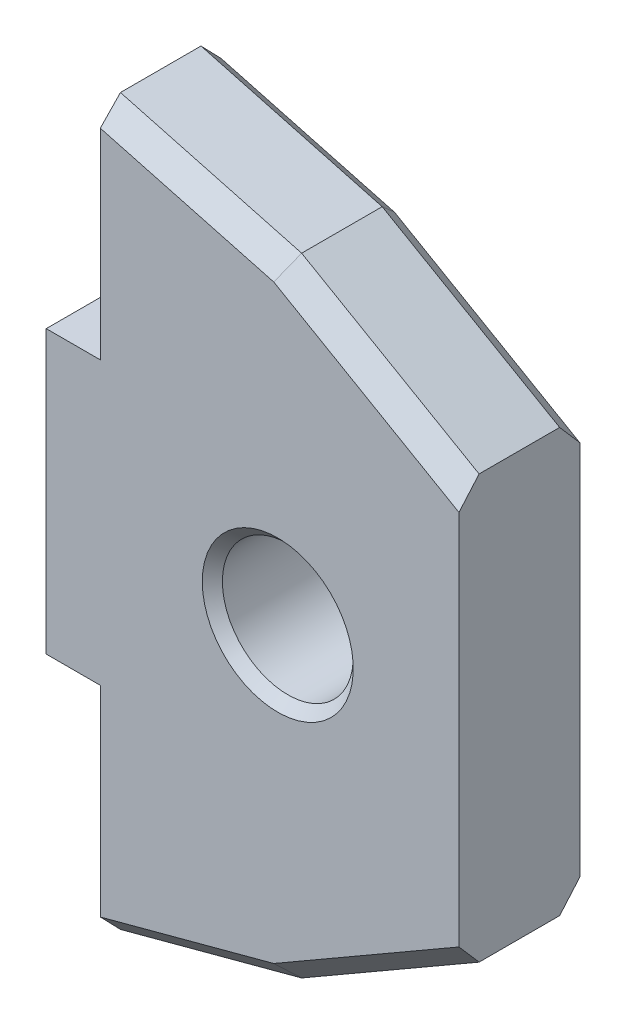
ISO-10303-21;
HEADER;
FILE_DESCRIPTION(('STEP AP214'),'2;1');
FILE_NAME('part.step','',(''),(''),'','','');
FILE_SCHEMA(('AUTOMOTIVE_DESIGN { 1 0 10303 214 1 1 1 1 }'));
ENDSEC;
DATA;
#1=APPLICATION_CONTEXT('core data for automotive mechanical design processes');
#2=APPLICATION_PROTOCOL_DEFINITION('international standard','automotive_design',2000,#1);
#3=PRODUCT_CONTEXT('',#1,'mechanical');
#4=PRODUCT('Part','Part','',(#3));
#5=PRODUCT_RELATED_PRODUCT_CATEGORY('part','',(#4));
#6=PRODUCT_DEFINITION_FORMATION('','',#4);
#7=PRODUCT_DEFINITION_CONTEXT('part definition',#1,'design');
#8=PRODUCT_DEFINITION('design','',#6,#7);
#9=PRODUCT_DEFINITION_SHAPE('','',#8);
#10=(LENGTH_UNIT() NAMED_UNIT(*) SI_UNIT(.MILLI.,.METRE.));
#11=(NAMED_UNIT(*) PLANE_ANGLE_UNIT() SI_UNIT($,.RADIAN.));
#12=(NAMED_UNIT(*) SI_UNIT($,.STERADIAN.) SOLID_ANGLE_UNIT());
#13=UNCERTAINTY_MEASURE_WITH_UNIT(LENGTH_MEASURE(1.E-05),#10,'distance_accuracy_value','');
#14=(GEOMETRIC_REPRESENTATION_CONTEXT(3) GLOBAL_UNCERTAINTY_ASSIGNED_CONTEXT((#13)) GLOBAL_UNIT_ASSIGNED_CONTEXT((#10,
#11,#12)) REPRESENTATION_CONTEXT('',''));
#15=CARTESIAN_POINT('',(0.,0.,0.));
#16=DIRECTION('',(0.,0.,1.));
#17=DIRECTION('',(1.,0.,0.));
#18=AXIS2_PLACEMENT_3D('',#15,#16,#17);
#19=CARTESIAN_POINT('',(23.3730669589466,-31.1769145362397,6.));
#20=DIRECTION('',(-0.500000000000001,0.866025403784438,0.));
#21=DIRECTION('',(-0.866025403784438,-0.500000000000001,0.));
#22=AXIS2_PLACEMENT_3D('',#19,#20,#21);
#23=PLANE('',#22);
#24=DIRECTION('',(0.,0.,-1.));
#25=VECTOR('',#24,1.);
#26=CARTESIAN_POINT('',(23.3730669589466,-31.1769145362397,6.));
#27=LINE('',#26,#25);
#28=CARTESIAN_POINT('',(23.3730669589466,-31.1769145362397,4.));
#29=VERTEX_POINT('',#28);
#30=CARTESIAN_POINT('',(23.3730669589466,-31.1769145362397,-4.00000000000001));
#31=VERTEX_POINT('',#30);
#32=EDGE_CURVE('E188',#29,#31,#27,.T.);
#33=ORIENTED_EDGE('',*,*,#32,.T.);
#34=DIRECTION('',(0.866025403784438,0.500000000000001,0.));
#35=VECTOR('',#34,1.);
#36=CARTESIAN_POINT('',(41.,-21.,-4.00000000000001));
#37=LINE('',#36,#35);
#38=CARTESIAN_POINT('',(41.,-21.,-4.00000000000001));
#39=VERTEX_POINT('',#38);
#40=EDGE_CURVE('E255',#31,#39,#37,.T.);
#41=ORIENTED_EDGE('',*,*,#40,.T.);
#42=DIRECTION('',(0.,0.,-1.));
#43=VECTOR('',#42,1.);
#44=CARTESIAN_POINT('',(41.,-21.,6.));
#45=LINE('',#44,#43);
#46=CARTESIAN_POINT('',(41.,-21.,4.));
#47=VERTEX_POINT('',#46);
#48=EDGE_CURVE('E221',#47,#39,#45,.T.);
#49=ORIENTED_EDGE('',*,*,#48,.F.);
#50=DIRECTION('',(-0.866025403784438,-0.500000000000001,0.));
#51=VECTOR('',#50,1.);
#52=CARTESIAN_POINT('',(23.3730669589466,-31.1769145362397,4.));
#53=LINE('',#52,#51);
#54=EDGE_CURVE('E253',#47,#29,#53,.T.);
#55=ORIENTED_EDGE('',*,*,#54,.T.);
#56=EDGE_LOOP('',(#33,#41,#49,#55));
#57=FACE_BOUND('',#56,.T.);
#58=ADVANCED_FACE('F41',(#57),#23,.F.);
#59=CARTESIAN_POINT('',(41.,21.,6.));
#60=DIRECTION('',(-1.,0.,0.));
#61=DIRECTION('',(0.,0.,1.));
#62=AXIS2_PLACEMENT_3D('',#59,#60,#61);
#63=PLANE('',#62);
#64=ORIENTED_EDGE('',*,*,#48,.T.);
#65=DIRECTION('',(0.,0.755928946018457,-0.654653670707974));
#66=VECTOR('',#65,1.);
#67=CARTESIAN_POINT('',(41.,-26.8153797349942,1.03626658315813));
#68=LINE('',#67,#66);
#69=CARTESIAN_POINT('',(41.,-18.6905989232415,-6.));
#70=VERTEX_POINT('',#69);
#71=EDGE_CURVE('E263',#39,#70,#68,.T.);
#72=ORIENTED_EDGE('',*,*,#71,.T.);
#73=DIRECTION('',(0.,1.,0.));
#74=VECTOR('',#73,1.);
#75=CARTESIAN_POINT('',(41.,21.,-6.));
#76=LINE('',#75,#74);
#77=CARTESIAN_POINT('',(41.,18.6905989232415,-6.));
#78=VERTEX_POINT('',#77);
#79=EDGE_CURVE('E189',#70,#78,#76,.T.);
#80=ORIENTED_EDGE('',*,*,#79,.T.);
#81=DIRECTION('',(0.,0.755928946018456,0.654653670707975));
#82=VECTOR('',#81,1.);
#83=CARTESIAN_POINT('',(41.,26.8153797349942,1.03626658315813));
#84=LINE('',#83,#82);
#85=CARTESIAN_POINT('',(41.,21.,-4.00000000000001));
#86=VERTEX_POINT('',#85);
#87=EDGE_CURVE('E259',#78,#86,#84,.T.);
#88=ORIENTED_EDGE('',*,*,#87,.T.);
#89=DIRECTION('',(0.,0.,-1.));
#90=VECTOR('',#89,1.);
#91=CARTESIAN_POINT('',(41.,21.,6.));
#92=LINE('',#91,#90);
#93=CARTESIAN_POINT('',(41.,21.,3.99999999999999));
#94=VERTEX_POINT('',#93);
#95=EDGE_CURVE('E218',#94,#86,#92,.T.);
#96=ORIENTED_EDGE('',*,*,#95,.F.);
#97=DIRECTION('',(0.,0.755928946018454,-0.654653670707978));
#98=VECTOR('',#97,1.);
#99=CARTESIAN_POINT('',(41.,26.165382378539,-0.473352360075262));
#100=LINE('',#99,#98);
#101=CARTESIAN_POINT('',(41.,18.6905989232415,6.));
#102=VERTEX_POINT('',#101);
#103=EDGE_CURVE('E257',#94,#102,#100,.F.);
#104=ORIENTED_EDGE('',*,*,#103,.T.);
#105=DIRECTION('',(0.,1.,0.));
#106=VECTOR('',#105,1.);
#107=CARTESIAN_POINT('',(41.,21.,6.));
#108=LINE('',#107,#106);
#109=CARTESIAN_POINT('',(41.,-18.6905989232415,6.));
#110=VERTEX_POINT('',#109);
#111=EDGE_CURVE('E164',#110,#102,#108,.T.);
#112=ORIENTED_EDGE('',*,*,#111,.F.);
#113=DIRECTION('',(0.,0.755928946018452,0.65465367070798));
#114=VECTOR('',#113,1.);
#115=CARTESIAN_POINT('',(41.,-26.165382378539,-0.473352360075265));
#116=LINE('',#115,#114);
#117=EDGE_CURVE('E261',#110,#47,#116,.F.);
#118=ORIENTED_EDGE('',*,*,#117,.T.);
#119=EDGE_LOOP('',(#64,#72,#80,#88,#96,#104,#112,#118));
#120=FACE_BOUND('',#119,.T.);
#121=ADVANCED_FACE('F303',(#120),#63,.F.);
#122=CARTESIAN_POINT('',(23.3730669589466,31.1769145362397,6.));
#123=DIRECTION('',(-0.500000000000001,-0.866025403784438,0.));
#124=DIRECTION('',(0.866025403784438,-0.500000000000001,0.));
#125=AXIS2_PLACEMENT_3D('',#122,#123,#124);
#126=PLANE('',#125);
#127=ORIENTED_EDGE('',*,*,#95,.T.);
#128=DIRECTION('',(-0.866025403784438,0.500000000000001,0.));
#129=VECTOR('',#128,1.);
#130=CARTESIAN_POINT('',(23.3730669589466,31.1769145362397,-4.00000000000001));
#131=LINE('',#130,#129);
#132=CARTESIAN_POINT('',(23.3730669589466,31.1769145362397,-4.00000000000001));
#133=VERTEX_POINT('',#132);
#134=EDGE_CURVE('E275',#86,#133,#131,.T.);
#135=ORIENTED_EDGE('',*,*,#134,.T.);
#136=DIRECTION('',(0.,0.,-1.));
#137=VECTOR('',#136,1.);
#138=CARTESIAN_POINT('',(23.3730669589466,31.1769145362397,6.));
#139=LINE('',#138,#137);
#140=CARTESIAN_POINT('',(23.3730669589466,31.1769145362397,3.99999999999999));
#141=VERTEX_POINT('',#140);
#142=EDGE_CURVE('E216',#141,#133,#139,.T.);
#143=ORIENTED_EDGE('',*,*,#142,.F.);
#144=DIRECTION('',(0.866025403784438,-0.500000000000001,0.));
#145=VECTOR('',#144,1.);
#146=CARTESIAN_POINT('',(23.3730669589466,31.1769145362397,3.99999999999999));
#147=LINE('',#146,#145);
#148=EDGE_CURVE('E273',#141,#94,#147,.T.);
#149=ORIENTED_EDGE('',*,*,#148,.T.);
#150=EDGE_LOOP('',(#127,#135,#143,#149));
#151=FACE_BOUND('',#150,.T.);
#152=ADVANCED_FACE('F301',(#151),#126,.F.);
#153=CARTESIAN_POINT('',(5.37306695894657,36.,6.));
#154=DIRECTION('',(-0.258819045102523,-0.965925826289068,0.));
#155=DIRECTION('',(0.965925826289068,-0.258819045102523,0.));
#156=AXIS2_PLACEMENT_3D('',#153,#154,#155);
#157=PLANE('',#156);
#158=ORIENTED_EDGE('',*,*,#142,.T.);
#159=DIRECTION('',(-0.965925826289068,0.258819045102523,0.));
#160=VECTOR('',#159,1.);
#161=CARTESIAN_POINT('',(5.37306695894657,36.,-4.00000000000001));
#162=LINE('',#161,#160);
#163=CARTESIAN_POINT('',(5.37306695894657,36.,-4.00000000000001));
#164=VERTEX_POINT('',#163);
#165=EDGE_CURVE('E59',#133,#164,#162,.T.);
#166=ORIENTED_EDGE('',*,*,#165,.T.);
#167=DIRECTION('',(0.,0.,-1.));
#168=VECTOR('',#167,1.);
#169=CARTESIAN_POINT('',(5.37306695894657,36.,6.));
#170=LINE('',#169,#168);
#171=CARTESIAN_POINT('',(5.37306695894657,36.,3.99999999999999));
#172=VERTEX_POINT('',#171);
#173=EDGE_CURVE('E173',#172,#164,#170,.T.);
#174=ORIENTED_EDGE('',*,*,#173,.F.);
#175=DIRECTION('',(0.965925826289068,-0.258819045102523,0.));
#176=VECTOR('',#175,1.);
#177=CARTESIAN_POINT('',(5.37306695894657,36.,3.99999999999999));
#178=LINE('',#177,#176);
#179=EDGE_CURVE('E278',#172,#141,#178,.T.);
#180=ORIENTED_EDGE('',*,*,#179,.T.);
#181=EDGE_LOOP('',(#158,#166,#174,#180));
#182=FACE_BOUND('',#181,.T.);
#183=ADVANCED_FACE('F309',(#182),#157,.F.);
#184=CARTESIAN_POINT('',(5.37306695894657,14.,6.));
#185=DIRECTION('',(1.,0.,0.));
#186=DIRECTION('',(0.,1.,0.));
#187=AXIS2_PLACEMENT_3D('',#184,#185,#186);
#188=PLANE('',#187);
#189=ORIENTED_EDGE('',*,*,#173,.T.);
#190=DIRECTION('',(0.,-0.719254596676406,-0.694746590606864));
#191=VECTOR('',#190,1.);
#192=CARTESIAN_POINT('',(5.37306695894657,36.,-4.00000000000001));
#193=LINE('',#192,#191);
#194=CARTESIAN_POINT('',(5.37306695894657,33.9294476391798,-6.));
#195=VERTEX_POINT('',#194);
#196=EDGE_CURVE('E11',#164,#195,#193,.T.);
#197=ORIENTED_EDGE('',*,*,#196,.T.);
#198=DIRECTION('',(0.,-1.,0.));
#199=VECTOR('',#198,1.);
#200=CARTESIAN_POINT('',(5.37306695894657,14.,-6.));
#201=LINE('',#200,#199);
#202=CARTESIAN_POINT('',(5.37306695894657,14.,-6.));
#203=VERTEX_POINT('',#202);
#204=EDGE_CURVE('E170',#195,#203,#201,.T.);
#205=ORIENTED_EDGE('',*,*,#204,.T.);
#206=DIRECTION('',(0.,0.,-1.));
#207=VECTOR('',#206,1.);
#208=CARTESIAN_POINT('',(5.37306695894657,14.,6.));
#209=LINE('',#208,#207);
#210=CARTESIAN_POINT('',(5.37306695894657,14.,6.));
#211=VERTEX_POINT('',#210);
#212=EDGE_CURVE('E167',#211,#203,#209,.T.);
#213=ORIENTED_EDGE('',*,*,#212,.F.);
#214=DIRECTION('',(0.,-1.,0.));
#215=VECTOR('',#214,1.);
#216=CARTESIAN_POINT('',(5.37306695894657,14.,6.));
#217=LINE('',#216,#215);
#218=CARTESIAN_POINT('',(5.37306695894657,33.9294476391798,6.));
#219=VERTEX_POINT('',#218);
#220=EDGE_CURVE('E155',#219,#211,#217,.T.);
#221=ORIENTED_EDGE('',*,*,#220,.F.);
#222=DIRECTION('',(0.,-0.719254596676403,0.694746590606866));
#223=VECTOR('',#222,1.);
#224=CARTESIAN_POINT('',(5.37306695894657,33.4485530837579,6.46450847080387));
#225=LINE('',#224,#223);
#226=EDGE_CURVE('E51',#219,#172,#225,.F.);
#227=ORIENTED_EDGE('',*,*,#226,.T.);
#228=EDGE_LOOP('',(#189,#197,#205,#213,#221,#227));
#229=FACE_BOUND('',#228,.T.);
#230=ADVANCED_FACE('F168',(#229),#188,.F.);
#231=CARTESIAN_POINT('',(0.,14.,6.));
#232=DIRECTION('',(0.,-1.,0.));
#233=DIRECTION('',(0.,0.,-1.));
#234=AXIS2_PLACEMENT_3D('',#231,#232,#233);
#235=PLANE('',#234);
#236=DIRECTION('',(-1.,0.,0.));
#237=VECTOR('',#236,1.);
#238=CARTESIAN_POINT('',(0.,14.,-6.));
#239=LINE('',#238,#237);
#240=CARTESIAN_POINT('',(0.,14.,-6.));
#241=VERTEX_POINT('',#240);
#242=EDGE_CURVE('E194',#203,#241,#239,.T.);
#243=ORIENTED_EDGE('',*,*,#242,.T.);
#244=DIRECTION('',(0.,0.,-1.));
#245=VECTOR('',#244,1.);
#246=CARTESIAN_POINT('',(0.,14.,6.));
#247=LINE('',#246,#245);
#248=CARTESIAN_POINT('',(0.,14.,6.));
#249=VERTEX_POINT('',#248);
#250=EDGE_CURVE('E174',#249,#241,#247,.T.);
#251=ORIENTED_EDGE('',*,*,#250,.F.);
#252=DIRECTION('',(-1.,0.,0.));
#253=VECTOR('',#252,1.);
#254=CARTESIAN_POINT('',(0.,14.,6.));
#255=LINE('',#254,#253);
#256=EDGE_CURVE('E160',#211,#249,#255,.T.);
#257=ORIENTED_EDGE('',*,*,#256,.F.);
#258=ORIENTED_EDGE('',*,*,#212,.T.);
#259=EDGE_LOOP('',(#243,#251,#257,#258));
#260=FACE_BOUND('',#259,.T.);
#261=ADVANCED_FACE('F176',(#260),#235,.F.);
#262=CARTESIAN_POINT('',(0.,-14.,6.));
#263=DIRECTION('',(1.,0.,0.));
#264=DIRECTION('',(0.,0.,-1.));
#265=AXIS2_PLACEMENT_3D('',#262,#263,#264);
#266=PLANE('',#265);
#267=DIRECTION('',(0.,-1.,0.));
#268=VECTOR('',#267,1.);
#269=CARTESIAN_POINT('',(0.,-14.,-6.));
#270=LINE('',#269,#268);
#271=CARTESIAN_POINT('',(0.,-14.,-6.));
#272=VERTEX_POINT('',#271);
#273=EDGE_CURVE('E196',#241,#272,#270,.T.);
#274=ORIENTED_EDGE('',*,*,#273,.T.);
#275=DIRECTION('',(0.,0.,-1.));
#276=VECTOR('',#275,1.);
#277=CARTESIAN_POINT('',(0.,-14.,6.));
#278=LINE('',#277,#276);
#279=CARTESIAN_POINT('',(0.,-14.,6.));
#280=VERTEX_POINT('',#279);
#281=EDGE_CURVE('E211',#280,#272,#278,.T.);
#282=ORIENTED_EDGE('',*,*,#281,.F.);
#283=DIRECTION('',(0.,-1.,0.));
#284=VECTOR('',#283,1.);
#285=CARTESIAN_POINT('',(0.,-14.,6.));
#286=LINE('',#285,#284);
#287=EDGE_CURVE('E179',#249,#280,#286,.T.);
#288=ORIENTED_EDGE('',*,*,#287,.F.);
#289=ORIENTED_EDGE('',*,*,#250,.T.);
#290=EDGE_LOOP('',(#274,#282,#288,#289));
#291=FACE_BOUND('',#290,.T.);
#292=ADVANCED_FACE('F319',(#291),#266,.F.);
#293=CARTESIAN_POINT('',(0.,-14.,6.));
#294=DIRECTION('',(0.,1.,0.));
#295=DIRECTION('',(0.,0.,1.));
#296=AXIS2_PLACEMENT_3D('',#293,#294,#295);
#297=PLANE('',#296);
#298=DIRECTION('',(1.,0.,0.));
#299=VECTOR('',#298,1.);
#300=CARTESIAN_POINT('',(0.,-14.,-6.));
#301=LINE('',#300,#299);
#302=CARTESIAN_POINT('',(5.37306695894657,-14.,-6.));
#303=VERTEX_POINT('',#302);
#304=EDGE_CURVE('E198',#272,#303,#301,.T.);
#305=ORIENTED_EDGE('',*,*,#304,.T.);
#306=DIRECTION('',(0.,0.,-1.));
#307=VECTOR('',#306,1.);
#308=CARTESIAN_POINT('',(5.37306695894657,-14.,6.));
#309=LINE('',#308,#307);
#310=CARTESIAN_POINT('',(5.37306695894657,-14.,6.));
#311=VERTEX_POINT('',#310);
#312=EDGE_CURVE('E208',#311,#303,#309,.T.);
#313=ORIENTED_EDGE('',*,*,#312,.F.);
#314=DIRECTION('',(1.,0.,0.));
#315=VECTOR('',#314,1.);
#316=CARTESIAN_POINT('',(0.,-14.,6.));
#317=LINE('',#316,#315);
#318=EDGE_CURVE('E181',#280,#311,#317,.T.);
#319=ORIENTED_EDGE('',*,*,#318,.F.);
#320=ORIENTED_EDGE('',*,*,#281,.T.);
#321=EDGE_LOOP('',(#305,#313,#319,#320));
#322=FACE_BOUND('',#321,.T.);
#323=ADVANCED_FACE('F326',(#322),#297,.F.);
#324=CARTESIAN_POINT('',(5.37306695894657,-14.,6.));
#325=DIRECTION('',(1.,0.,0.));
#326=DIRECTION('',(0.,1.,0.));
#327=AXIS2_PLACEMENT_3D('',#324,#325,#326);
#328=PLANE('',#327);
#329=DIRECTION('',(0.,-1.,0.));
#330=VECTOR('',#329,1.);
#331=CARTESIAN_POINT('',(5.37306695894657,-14.,-6.));
#332=LINE('',#331,#330);
#333=CARTESIAN_POINT('',(5.37306695894657,-33.9294476391798,-6.));
#334=VERTEX_POINT('',#333);
#335=EDGE_CURVE('E200',#303,#334,#332,.T.);
#336=ORIENTED_EDGE('',*,*,#335,.T.);
#337=DIRECTION('',(0.,-0.719254596676405,0.694746590606864));
#338=VECTOR('',#337,1.);
#339=CARTESIAN_POINT('',(5.37306695894657,-36.,-4.00000000000001));
#340=LINE('',#339,#338);
#341=CARTESIAN_POINT('',(5.37306695894657,-36.,-4.00000000000001));
#342=VERTEX_POINT('',#341);
#343=EDGE_CURVE('E251',#334,#342,#340,.T.);
#344=ORIENTED_EDGE('',*,*,#343,.T.);
#345=DIRECTION('',(0.,0.,-1.));
#346=VECTOR('',#345,1.);
#347=CARTESIAN_POINT('',(5.37306695894657,-36.,6.));
#348=LINE('',#347,#346);
#349=CARTESIAN_POINT('',(5.37306695894657,-36.,4.));
#350=VERTEX_POINT('',#349);
#351=EDGE_CURVE('E205',#350,#342,#348,.T.);
#352=ORIENTED_EDGE('',*,*,#351,.F.);
#353=DIRECTION('',(0.,-0.719254596676402,-0.694746590606867));
#354=VECTOR('',#353,1.);
#355=CARTESIAN_POINT('',(5.37306695894657,-33.4485530837579,6.46450847080387));
#356=LINE('',#355,#354);
#357=CARTESIAN_POINT('',(5.37306695894657,-33.9294476391798,6.));
#358=VERTEX_POINT('',#357);
#359=EDGE_CURVE('E249',#350,#358,#356,.F.);
#360=ORIENTED_EDGE('',*,*,#359,.T.);
#361=DIRECTION('',(0.,-1.,0.));
#362=VECTOR('',#361,1.);
#363=CARTESIAN_POINT('',(5.37306695894657,-14.,6.));
#364=LINE('',#363,#362);
#365=EDGE_CURVE('E186',#311,#358,#364,.T.);
#366=ORIENTED_EDGE('',*,*,#365,.F.);
#367=ORIENTED_EDGE('',*,*,#312,.T.);
#368=EDGE_LOOP('',(#336,#344,#352,#360,#366,#367));
#369=FACE_BOUND('',#368,.T.);
#370=ADVANCED_FACE('F329',(#369),#328,.F.);
#371=CARTESIAN_POINT('',(5.37306695894657,-36.,6.));
#372=DIRECTION('',(-0.258819045102523,0.965925826289068,0.));
#373=DIRECTION('',(-0.965925826289068,-0.258819045102523,0.));
#374=AXIS2_PLACEMENT_3D('',#371,#372,#373);
#375=PLANE('',#374);
#376=ORIENTED_EDGE('',*,*,#351,.T.);
#377=DIRECTION('',(0.965925826289068,0.258819045102523,0.));
#378=VECTOR('',#377,1.);
#379=CARTESIAN_POINT('',(23.3730669589466,-31.1769145362397,-4.00000000000001));
#380=LINE('',#379,#378);
#381=EDGE_CURVE('E238',#342,#31,#380,.T.);
#382=ORIENTED_EDGE('',*,*,#381,.T.);
#383=ORIENTED_EDGE('',*,*,#32,.F.);
#384=DIRECTION('',(-0.965925826289068,-0.258819045102523,0.));
#385=VECTOR('',#384,1.);
#386=CARTESIAN_POINT('',(5.37306695894657,-36.,4.));
#387=LINE('',#386,#385);
#388=EDGE_CURVE('E236',#29,#350,#387,.T.);
#389=ORIENTED_EDGE('',*,*,#388,.T.);
#390=EDGE_LOOP('',(#376,#382,#383,#389));
#391=FACE_BOUND('',#390,.T.);
#392=ADVANCED_FACE('F345',(#391),#375,.F.);
#393=CARTESIAN_POINT('',(0.,0.,6.));
#394=DIRECTION('',(0.,0.,-1.));
#395=DIRECTION('',(-1.,0.,0.));
#396=AXIS2_PLACEMENT_3D('',#393,#394,#395);
#397=PLANE('',#396);
#398=CARTESIAN_POINT('',(23.,0.,6.));
#399=DIRECTION('',(0.,0.,-1.));
#400=DIRECTION('',(-1.,0.,0.));
#401=AXIS2_PLACEMENT_3D('',#398,#399,#400);
#402=CIRCLE('',#401,7.5);
#403=CARTESIAN_POINT('',(15.5,0.,6.));
#404=VERTEX_POINT('',#403);
#405=EDGE_CURVE('E230',#404,#404,#402,.T.);
#406=ORIENTED_EDGE('',*,*,#405,.T.);
#407=EDGE_LOOP('',(#406));
#408=FACE_BOUND('',#407,.T.);
#409=ORIENTED_EDGE('',*,*,#365,.T.);
#410=DIRECTION('',(0.965925826289068,0.258819045102523,0.));
#411=VECTOR('',#410,1.);
#412=CARTESIAN_POINT('',(8.84228914792704,-32.9998723552784,6.));
#413=LINE('',#412,#411);
#414=CARTESIAN_POINT('',(22.6010957737113,-29.3132112310835,6.));
#415=VERTEX_POINT('',#414);
#416=EDGE_CURVE('E270',#358,#415,#413,.T.);
#417=ORIENTED_EDGE('',*,*,#416,.T.);
#418=DIRECTION('',(0.866025403784438,0.500000000000001,0.));
#419=VECTOR('',#418,1.);
#420=CARTESIAN_POINT('',(18.3432667397367,-31.7714699700121,6.));
#421=LINE('',#420,#419);
#422=EDGE_CURVE('E268',#415,#110,#421,.T.);
#423=ORIENTED_EDGE('',*,*,#422,.T.);
#424=ORIENTED_EDGE('',*,*,#111,.T.);
#425=DIRECTION('',(-0.866025403784438,0.500000000000001,0.));
#426=VECTOR('',#425,1.);
#427=CARTESIAN_POINT('',(18.3432667397367,31.7714699700121,6.));
#428=LINE('',#427,#426);
#429=CARTESIAN_POINT('',(22.6010957737113,29.3132112310835,6.));
#430=VERTEX_POINT('',#429);
#431=EDGE_CURVE('E265',#102,#430,#428,.T.);
#432=ORIENTED_EDGE('',*,*,#431,.T.);
#433=DIRECTION('',(-0.965925826289068,0.258819045102523,0.));
#434=VECTOR('',#433,1.);
#435=CARTESIAN_POINT('',(8.84228914792704,32.9998723552784,6.));
#436=LINE('',#435,#434);
#437=EDGE_CURVE('E163',#430,#219,#436,.T.);
#438=ORIENTED_EDGE('',*,*,#437,.T.);
#439=ORIENTED_EDGE('',*,*,#220,.T.);
#440=ORIENTED_EDGE('',*,*,#256,.T.);
#441=ORIENTED_EDGE('',*,*,#287,.T.);
#442=ORIENTED_EDGE('',*,*,#318,.T.);
#443=EDGE_LOOP('',(#409,#417,#423,#424,#432,#438,#439,#440,#441,#442));
#444=FACE_BOUND('',#443,.T.);
#445=ADVANCED_FACE('F158',(#408,#444),#397,.F.);
#446=CARTESIAN_POINT('',(0.,0.,-6.));
#447=DIRECTION('',(0.,0.,-1.));
#448=DIRECTION('',(-1.,0.,0.));
#449=AXIS2_PLACEMENT_3D('',#446,#447,#448);
#450=PLANE('',#449);
#451=CARTESIAN_POINT('',(23.,0.,-6.));
#452=DIRECTION('',(0.,0.,-1.));
#453=DIRECTION('',(-1.,0.,0.));
#454=AXIS2_PLACEMENT_3D('',#451,#452,#453);
#455=CIRCLE('',#454,7.5);
#456=CARTESIAN_POINT('',(15.5,0.,-6.));
#457=VERTEX_POINT('',#456);
#458=EDGE_CURVE('E233',#457,#457,#455,.F.);
#459=ORIENTED_EDGE('',*,*,#458,.T.);
#460=EDGE_LOOP('',(#459));
#461=FACE_BOUND('',#460,.T.);
#462=DIRECTION('',(-0.866025403784438,-0.500000000000001,0.));
#463=VECTOR('',#462,1.);
#464=CARTESIAN_POINT('',(22.3730669589466,-29.4448637286709,-6.));
#465=LINE('',#464,#463);
#466=CARTESIAN_POINT('',(22.6010957737113,-29.3132112310835,-6.));
#467=VERTEX_POINT('',#466);
#468=EDGE_CURVE('E245',#70,#467,#465,.T.);
#469=ORIENTED_EDGE('',*,*,#468,.T.);
#470=DIRECTION('',(-0.965925826289068,-0.258819045102523,0.));
#471=VECTOR('',#470,1.);
#472=CARTESIAN_POINT('',(4.85542886874152,-34.0681483474219,-6.));
#473=LINE('',#472,#471);
#474=EDGE_CURVE('E247',#467,#334,#473,.T.);
#475=ORIENTED_EDGE('',*,*,#474,.T.);
#476=ORIENTED_EDGE('',*,*,#335,.F.);
#477=ORIENTED_EDGE('',*,*,#304,.F.);
#478=ORIENTED_EDGE('',*,*,#273,.F.);
#479=ORIENTED_EDGE('',*,*,#242,.F.);
#480=ORIENTED_EDGE('',*,*,#204,.F.);
#481=DIRECTION('',(0.965925826289068,-0.258819045102523,0.));
#482=VECTOR('',#481,1.);
#483=CARTESIAN_POINT('',(22.8554288687415,29.2450628836616,-6.));
#484=LINE('',#483,#482);
#485=CARTESIAN_POINT('',(22.6010957737113,29.3132112310835,-6.));
#486=VERTEX_POINT('',#485);
#487=EDGE_CURVE('E241',#195,#486,#484,.T.);
#488=ORIENTED_EDGE('',*,*,#487,.T.);
#489=DIRECTION('',(0.866025403784438,-0.500000000000001,0.));
#490=VECTOR('',#489,1.);
#491=CARTESIAN_POINT('',(40.,19.2679491924311,-6.));
#492=LINE('',#491,#490);
#493=EDGE_CURVE('E243',#486,#78,#492,.T.);
#494=ORIENTED_EDGE('',*,*,#493,.T.);
#495=ORIENTED_EDGE('',*,*,#79,.F.);
#496=EDGE_LOOP('',(#469,#475,#476,#477,#478,#479,#480,#488,#494,#495));
#497=FACE_BOUND('',#496,.T.);
#498=ADVANCED_FACE('F315',(#461,#497),#450,.T.);
#499=CARTESIAN_POINT('',(23.,0.,-6.));
#500=DIRECTION('',(0.,0.,1.));
#501=DIRECTION('',(1.,0.,0.));
#502=AXIS2_PLACEMENT_3D('',#499,#500,#501);
#503=CYLINDRICAL_SURFACE('',#502,6.5);
#504=CARTESIAN_POINT('',(23.,0.,4.99999999999999));
#505=DIRECTION('',(0.,0.,-1.));
#506=DIRECTION('',(-1.,0.,0.));
#507=AXIS2_PLACEMENT_3D('',#504,#505,#506);
#508=CIRCLE('',#507,6.5);
#509=CARTESIAN_POINT('',(16.5,0.,4.99999999999999));
#510=VERTEX_POINT('',#509);
#511=EDGE_CURVE('E227',#510,#510,#508,.F.);
#512=ORIENTED_EDGE('',*,*,#511,.T.);
#513=EDGE_LOOP('',(#512));
#514=FACE_BOUND('',#513,.T.);
#515=CARTESIAN_POINT('',(23.,0.,-5.));
#516=DIRECTION('',(0.,0.,-1.));
#517=DIRECTION('',(-1.,0.,0.));
#518=AXIS2_PLACEMENT_3D('',#515,#516,#517);
#519=CIRCLE('',#518,6.5);
#520=CARTESIAN_POINT('',(16.5,0.,-5.));
#521=VERTEX_POINT('',#520);
#522=EDGE_CURVE('E224',#521,#521,#519,.T.);
#523=ORIENTED_EDGE('',*,*,#522,.T.);
#524=EDGE_LOOP('',(#523));
#525=FACE_BOUND('',#524,.T.);
#526=ADVANCED_FACE('F384',(#514,#525),#503,.F.);
#527=CARTESIAN_POINT('',(23.,0.,4.99999999999999));
#528=DIRECTION('',(0.,0.,1.));
#529=DIRECTION('',(1.,0.,0.));
#530=AXIS2_PLACEMENT_3D('',#527,#528,#529);
#531=CONICAL_SURFACE('',#530,6.5,0.785398163397445);
#532=ORIENTED_EDGE('',*,*,#405,.F.);
#533=EDGE_LOOP('',(#532));
#534=FACE_BOUND('',#533,.T.);
#535=ORIENTED_EDGE('',*,*,#511,.F.);
#536=EDGE_LOOP('',(#535));
#537=FACE_BOUND('',#536,.T.);
#538=ADVANCED_FACE('F366',(#534,#537),#531,.F.);
#539=CARTESIAN_POINT('',(23.,0.,-6.));
#540=DIRECTION('',(0.,0.,-1.));
#541=DIRECTION('',(-1.,0.,0.));
#542=AXIS2_PLACEMENT_3D('',#539,#540,#541);
#543=CONICAL_SURFACE('',#542,7.5,0.78539816339745);
#544=ORIENTED_EDGE('',*,*,#522,.F.);
#545=EDGE_LOOP('',(#544));
#546=FACE_BOUND('',#545,.T.);
#547=ORIENTED_EDGE('',*,*,#458,.F.);
#548=EDGE_LOOP('',(#547));
#549=FACE_BOUND('',#548,.T.);
#550=ADVANCED_FACE('F358',(#546,#549),#543,.F.);
#551=CARTESIAN_POINT('',(23.3730669589466,-31.1769145362397,-4.00000000000001));
#552=DIRECTION('',(0.353553390593273,-0.612372435695792,-0.70710678118655));
#553=DIRECTION('',(-0.866025403784438,-0.500000000000001,0.));
#554=AXIS2_PLACEMENT_3D('',#551,#552,#553);
#555=PLANE('',#554);
#556=ORIENTED_EDGE('',*,*,#71,.F.);
#557=ORIENTED_EDGE('',*,*,#40,.F.);
#558=DIRECTION('',(-0.271758016897821,0.656081890078314,-0.704062592219634));
#559=VECTOR('',#558,1.);
#560=CARTESIAN_POINT('',(23.3730669589466,-31.1769145362397,-4.00000000000001));
#561=LINE('',#560,#559);
#562=EDGE_CURVE('E192',#467,#31,#561,.F.);
#563=ORIENTED_EDGE('',*,*,#562,.F.);
#564=ORIENTED_EDGE('',*,*,#468,.F.);
#565=EDGE_LOOP('',(#556,#557,#563,#564));
#566=FACE_BOUND('',#565,.T.);
#567=ADVANCED_FACE('F356',(#566),#555,.T.);
#568=CARTESIAN_POINT('',(5.37306695894657,-36.,-4.00000000000001));
#569=DIRECTION('',(0.18301270189222,-0.683012701892217,-0.707106781186549));
#570=DIRECTION('',(-0.965925826289068,-0.258819045102523,0.));
#571=AXIS2_PLACEMENT_3D('',#568,#569,#570);
#572=PLANE('',#571);
#573=ORIENTED_EDGE('',*,*,#343,.F.);
#574=ORIENTED_EDGE('',*,*,#474,.F.);
#575=ORIENTED_EDGE('',*,*,#562,.T.);
#576=ORIENTED_EDGE('',*,*,#381,.F.);
#577=EDGE_LOOP('',(#573,#574,#575,#576));
#578=FACE_BOUND('',#577,.T.);
#579=ADVANCED_FACE('F349',(#578),#572,.T.);
#580=CARTESIAN_POINT('',(18.3432667397367,-31.7714699700121,6.));
#581=DIRECTION('',(-0.353553390593276,0.612372435695796,-0.707106781186545));
#582=DIRECTION('',(0.866025403784438,0.500000000000001,0.));
#583=AXIS2_PLACEMENT_3D('',#580,#581,#582);
#584=PLANE('',#583);
#585=ORIENTED_EDGE('',*,*,#117,.F.);
#586=ORIENTED_EDGE('',*,*,#422,.F.);
#587=DIRECTION('',(0.271758016897807,-0.656081890078314,-0.704062592219639));
#588=VECTOR('',#587,1.);
#589=CARTESIAN_POINT('',(22.7249413005322,-29.6122007815737,5.67914469039891));
#590=LINE('',#589,#588);
#591=EDGE_CURVE('E283',#29,#415,#590,.F.);
#592=ORIENTED_EDGE('',*,*,#591,.F.);
#593=ORIENTED_EDGE('',*,*,#54,.F.);
#594=EDGE_LOOP('',(#585,#586,#592,#593));
#595=FACE_BOUND('',#594,.T.);
#596=ADVANCED_FACE('F341',(#595),#584,.F.);
#597=CARTESIAN_POINT('',(8.84228914792704,-32.9998723552784,6.));
#598=DIRECTION('',(-0.183012701892221,0.683012701892221,-0.707106781186545));
#599=DIRECTION('',(0.965925826289068,0.258819045102523,0.));
#600=AXIS2_PLACEMENT_3D('',#597,#598,#599);
#601=PLANE('',#600);
#602=ORIENTED_EDGE('',*,*,#359,.F.);
#603=ORIENTED_EDGE('',*,*,#388,.F.);
#604=ORIENTED_EDGE('',*,*,#591,.T.);
#605=ORIENTED_EDGE('',*,*,#416,.F.);
#606=EDGE_LOOP('',(#602,#603,#604,#605));
#607=FACE_BOUND('',#606,.T.);
#608=ADVANCED_FACE('F334',(#607),#601,.F.);
#609=CARTESIAN_POINT('',(5.37306695894657,36.,-4.00000000000001));
#610=DIRECTION('',(0.18301270189222,0.683012701892217,-0.707106781186549));
#611=DIRECTION('',(0.965925826289068,-0.258819045102523,0.));
#612=AXIS2_PLACEMENT_3D('',#609,#610,#611);
#613=PLANE('',#612);
#614=ORIENTED_EDGE('',*,*,#196,.F.);
#615=ORIENTED_EDGE('',*,*,#165,.F.);
#616=DIRECTION('',(-0.271758016897812,-0.656081890078317,-0.704062592219635));
#617=VECTOR('',#616,1.);
#618=CARTESIAN_POINT('',(22.9036579022681,30.0436608253059,-5.21613103094091));
#619=LINE('',#618,#617);
#620=EDGE_CURVE('E284',#486,#133,#619,.F.);
#621=ORIENTED_EDGE('',*,*,#620,.F.);
#622=ORIENTED_EDGE('',*,*,#487,.F.);
#623=EDGE_LOOP('',(#614,#615,#621,#622));
#624=FACE_BOUND('',#623,.T.);
#625=ADVANCED_FACE('F313',(#624),#613,.T.);
#626=CARTESIAN_POINT('',(23.3730669589466,31.1769145362397,-4.00000000000001));
#627=DIRECTION('',(0.353553390593274,0.612372435695793,-0.707106781186549));
#628=DIRECTION('',(0.866025403784438,-0.500000000000001,0.));
#629=AXIS2_PLACEMENT_3D('',#626,#627,#628);
#630=PLANE('',#629);
#631=ORIENTED_EDGE('',*,*,#87,.F.);
#632=ORIENTED_EDGE('',*,*,#493,.F.);
#633=ORIENTED_EDGE('',*,*,#620,.T.);
#634=ORIENTED_EDGE('',*,*,#134,.F.);
#635=EDGE_LOOP('',(#631,#632,#633,#634));
#636=FACE_BOUND('',#635,.T.);
#637=ADVANCED_FACE('F308',(#636),#630,.T.);
#638=CARTESIAN_POINT('',(18.3432667397367,31.7714699700121,6.));
#639=DIRECTION('',(-0.353553390593275,-0.612372435695795,-0.707106781186547));
#640=DIRECTION('',(-0.866025403784438,0.500000000000001,0.));
#641=AXIS2_PLACEMENT_3D('',#638,#639,#640);
#642=PLANE('',#641);
#643=ORIENTED_EDGE('',*,*,#103,.F.);
#644=ORIENTED_EDGE('',*,*,#148,.F.);
#645=DIRECTION('',(-0.271758016897811,-0.656081890078315,0.704062592219637));
#646=VECTOR('',#645,1.);
#647=CARTESIAN_POINT('',(22.7249413005322,29.6122007815737,5.67914469039892));
#648=LINE('',#647,#646);
#649=EDGE_CURVE('E46',#430,#141,#648,.F.);
#650=ORIENTED_EDGE('',*,*,#649,.F.);
#651=ORIENTED_EDGE('',*,*,#431,.F.);
#652=EDGE_LOOP('',(#643,#644,#650,#651));
#653=FACE_BOUND('',#652,.T.);
#654=ADVANCED_FACE('F44',(#653),#642,.F.);
#655=CARTESIAN_POINT('',(8.84228914792704,32.9998723552784,6.));
#656=DIRECTION('',(-0.183012701892221,-0.68301270189222,-0.707106781186547));
#657=DIRECTION('',(-0.965925826289068,0.258819045102523,0.));
#658=AXIS2_PLACEMENT_3D('',#655,#656,#657);
#659=PLANE('',#658);
#660=ORIENTED_EDGE('',*,*,#649,.T.);
#661=ORIENTED_EDGE('',*,*,#179,.F.);
#662=ORIENTED_EDGE('',*,*,#226,.F.);
#663=ORIENTED_EDGE('',*,*,#437,.F.);
#664=EDGE_LOOP('',(#660,#661,#662,#663));
#665=FACE_BOUND('',#664,.T.);
#666=ADVANCED_FACE('F293',(#665),#659,.F.);
#667=CLOSED_SHELL('',(#58,#121,#152,#183,#230,#261,#292,#323,#370,#392,#445,#498,#526,#538,#550,
#567,#579,#596,#608,#625,#637,#654,#666));
#668=MANIFOLD_SOLID_BREP('B2',#667);
#669=ADVANCED_BREP_SHAPE_REPRESENTATION('',(#18,#668),#14);
#670=SHAPE_DEFINITION_REPRESENTATION(#9,#669);
ENDSEC;
END-ISO-10303-21;
